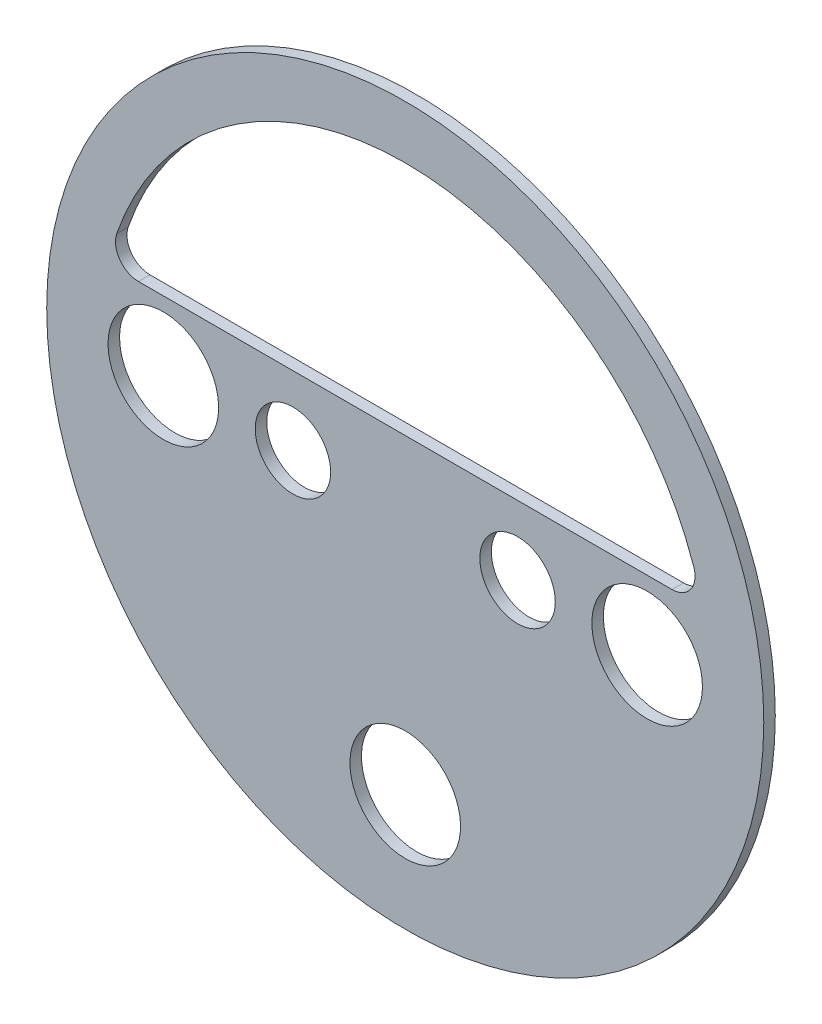
ISO-10303-21;
HEADER;
FILE_DESCRIPTION(('STEP AP214'),'2;1');
FILE_NAME('part.step','',(''),(''),'','','');
FILE_SCHEMA(('AUTOMOTIVE_DESIGN { 1 0 10303 214 1 1 1 1 }'));
ENDSEC;
DATA;
#1=APPLICATION_CONTEXT('core data for automotive mechanical design processes');
#2=APPLICATION_PROTOCOL_DEFINITION('international standard','automotive_design',2000,#1);
#3=PRODUCT_CONTEXT('',#1,'mechanical');
#4=PRODUCT('Part','Part','',(#3));
#5=PRODUCT_RELATED_PRODUCT_CATEGORY('part','',(#4));
#6=PRODUCT_DEFINITION_FORMATION('','',#4);
#7=PRODUCT_DEFINITION_CONTEXT('part definition',#1,'design');
#8=PRODUCT_DEFINITION('design','',#6,#7);
#9=PRODUCT_DEFINITION_SHAPE('','',#8);
#10=(LENGTH_UNIT() NAMED_UNIT(*) SI_UNIT(.MILLI.,.METRE.));
#11=(NAMED_UNIT(*) PLANE_ANGLE_UNIT() SI_UNIT($,.RADIAN.));
#12=(NAMED_UNIT(*) SI_UNIT($,.STERADIAN.) SOLID_ANGLE_UNIT());
#13=UNCERTAINTY_MEASURE_WITH_UNIT(LENGTH_MEASURE(1.E-05),#10,'distance_accuracy_value','');
#14=(GEOMETRIC_REPRESENTATION_CONTEXT(3) GLOBAL_UNCERTAINTY_ASSIGNED_CONTEXT((#13)) GLOBAL_UNIT_ASSIGNED_CONTEXT((#10,
#11,#12)) REPRESENTATION_CONTEXT('',''));
#15=CARTESIAN_POINT('',(0.,0.,0.));
#16=DIRECTION('',(0.,0.,1.));
#17=DIRECTION('',(1.,0.,0.));
#18=AXIS2_PLACEMENT_3D('',#15,#16,#17);
#19=CARTESIAN_POINT('',(-46.31414470764,16.,-1.000062000469));
#20=DIRECTION('',(0.,0.,1.));
#21=DIRECTION('',(0.,-1.,0.));
#22=AXIS2_PLACEMENT_3D('',#19,#20,#21);
#23=CYLINDRICAL_SURFACE('',#22,4.);
#24=CARTESIAN_POINT('',(-50.0949362899794,17.3059919643366,0.));
#25=DIRECTION('',(0.,0.,1.));
#26=VECTOR('',#25,1.);
#27=LINE('',#24,#26);
#28=CARTESIAN_POINT('',(-50.09491843085,17.30598579529,0.));
#29=VERTEX_POINT('',#28);
#30=CARTESIAN_POINT('',(-50.0949184298102,17.3059857949308,2.));
#31=VERTEX_POINT('',#30);
#32=EDGE_CURVE('E11',#29,#31,#27,.T.);
#33=ORIENTED_EDGE('',*,*,#32,.T.);
#34=CARTESIAN_POINT('',(-46.31414470764,16.,2.));
#35=DIRECTION('',(0.,0.,1.));
#36=DIRECTION('',(-0.945220430322506,0.326432746673702,0.));
#37=AXIS2_PLACEMENT_3D('',#34,#35,#36);
#38=CIRCLE('',#37,4.);
#39=CARTESIAN_POINT('',(-46.31414470764,12.,2.));
#40=VERTEX_POINT('',#39);
#41=EDGE_CURVE('E169',#31,#40,#38,.T.);
#42=ORIENTED_EDGE('',*,*,#41,.T.);
#43=DIRECTION('',(0.,0.,1.));
#44=VECTOR('',#43,1.);
#45=CARTESIAN_POINT('',(-46.31414470764,12.,0.));
#46=LINE('',#45,#44);
#47=CARTESIAN_POINT('',(-46.31414470764,12.,0.));
#48=VERTEX_POINT('',#47);
#49=EDGE_CURVE('E65',#48,#40,#46,.T.);
#50=ORIENTED_EDGE('',*,*,#49,.F.);
#51=CARTESIAN_POINT('',(-46.31414470764,16.,0.));
#52=DIRECTION('',(0.,0.,1.));
#53=DIRECTION('',(-0.945220430322506,0.326432746673702,0.));
#54=AXIS2_PLACEMENT_3D('',#51,#52,#53);
#55=CIRCLE('',#54,4.);
#56=EDGE_CURVE('E193',#29,#48,#55,.T.);
#57=ORIENTED_EDGE('',*,*,#56,.F.);
#58=EDGE_LOOP('',(#33,#42,#50,#57));
#59=FACE_BOUND('',#58,.T.);
#60=ADVANCED_FACE('F17',(#59),#23,.F.);
#61=CARTESIAN_POINT('',(0.,0.,2.));
#62=DIRECTION('',(0.,0.,-1.));
#63=DIRECTION('',(-1.,0.,0.));
#64=AXIS2_PLACEMENT_3D('',#61,#62,#63);
#65=CYLINDRICAL_SURFACE('',#64,53.);
#66=CARTESIAN_POINT('',(50.0949240913461,17.3060272819118,4.74897898783411E-11));
#67=CARTESIAN_POINT('',(50.0949254613367,17.306023316266,0.083333333370931));
#68=CARTESIAN_POINT('',(50.0949268313268,17.30601935062,0.166666666694372));
#69=CARTESIAN_POINT('',(50.094929571306,17.3060114193278,0.333333333341255));
#70=CARTESIAN_POINT('',(50.0949309412952,17.3060074536815,0.416666666664696));
#71=CARTESIAN_POINT('',(50.0949336812726,17.3059995223887,0.583333333311579));
#72=CARTESIAN_POINT('',(50.0949350512608,17.3059955567421,0.66666666663502));
#73=CARTESIAN_POINT('',(50.0949377912363,17.3059876254486,0.833333333281902));
#74=CARTESIAN_POINT('',(50.0949391612236,17.3059836598017,0.916666666605344));
#75=CARTESIAN_POINT('',(50.0949419011973,17.3059757285075,1.08333333325223));
#76=CARTESIAN_POINT('',(50.0949432711836,17.3059717628602,1.16666666657567));
#77=CARTESIAN_POINT('',(50.0949460111553,17.3059638315654,1.33333333322255));
#78=CARTESIAN_POINT('',(50.0949473811407,17.3059598659178,1.41666666654599));
#79=CARTESIAN_POINT('',(50.0949501211106,17.3059519346224,1.58333333319287));
#80=CARTESIAN_POINT('',(50.094951491095,17.3059479689745,1.66666666651631));
#81=CARTESIAN_POINT('',(50.094954231063,17.3059400376783,1.8333333331632));
#82=CARTESIAN_POINT('',(50.0949556010465,17.3059360720301,1.91666666648664));
#83=CARTESIAN_POINT('',(50.0949569710296,17.3059321063817,1.99999999981008));
#84=B_SPLINE_CURVE_WITH_KNOTS('',3,(#66,#67,#68,#69,#70,#71,#72,#73,#74,#75,#76,#77,#78,#79,#80,
#81,#82,#83),.UNSPECIFIED.,.F.,.F.,(4,2,2,2,2,2,2,2,4),(0.,0.250000000287182,0.500000000574363,
0.750000000861545,1.00000000114873,1.25000000143591,1.50000000172309,1.75000000201027,
2.00000000229745),.UNSPECIFIED.);
#85=CARTESIAN_POINT('',(50.0949045505953,17.306020531329,0.));
#86=VERTEX_POINT('',#85);
#87=CARTESIAN_POINT('',(50.094930916382,17.3059231054765,1.99999999981008));
#88=VERTEX_POINT('',#87);
#89=EDGE_CURVE('E31',#86,#88,#84,.T.);
#90=ORIENTED_EDGE('',*,*,#89,.T.);
#91=CARTESIAN_POINT('',(0.,0.,2.));
#92=DIRECTION('',(0.,0.,1.));
#93=DIRECTION('',(0.945190348723728,0.32651983811021,0.));
#94=AXIS2_PLACEMENT_3D('',#91,#92,#93);
#95=CIRCLE('',#94,53.);
#96=EDGE_CURVE('E183',#88,#31,#95,.T.);
#97=ORIENTED_EDGE('',*,*,#96,.T.);
#98=ORIENTED_EDGE('',*,*,#32,.F.);
#99=CARTESIAN_POINT('',(0.,0.,0.));
#100=DIRECTION('',(0.,0.,1.));
#101=DIRECTION('',(0.945188487637394,0.326525225423298,0.));
#102=AXIS2_PLACEMENT_3D('',#99,#100,#101);
#103=CIRCLE('',#102,53.);
#104=EDGE_CURVE('E197',#86,#29,#103,.T.);
#105=ORIENTED_EDGE('',*,*,#104,.F.);
#106=EDGE_LOOP('',(#90,#97,#98,#105));
#107=FACE_BOUND('',#106,.T.);
#108=ADVANCED_FACE('F19',(#107),#65,.F.);
#109=CARTESIAN_POINT('',(46.31414470764,16.,-1.0000358));
#110=DIRECTION('',(0.,0.,1.));
#111=DIRECTION('',(0.945186626686484,0.326530612244894,0.));
#112=AXIS2_PLACEMENT_3D('',#109,#110,#111);
#113=CYLINDRICAL_SURFACE('',#112,4.);
#114=DIRECTION('',(0.,0.,1.));
#115=VECTOR('',#114,1.);
#116=CARTESIAN_POINT('',(46.31414470764,12.,0.));
#117=LINE('',#116,#115);
#118=CARTESIAN_POINT('',(46.31414470764,12.,0.));
#119=VERTEX_POINT('',#118);
#120=CARTESIAN_POINT('',(46.31414470764,12.,2.));
#121=VERTEX_POINT('',#120);
#122=EDGE_CURVE('E182',#119,#121,#117,.T.);
#123=ORIENTED_EDGE('',*,*,#122,.T.);
#124=CARTESIAN_POINT('',(46.31414470764,16.,2.));
#125=DIRECTION('',(0.,0.,1.));
#126=DIRECTION('',(0.,-1.,0.));
#127=AXIS2_PLACEMENT_3D('',#124,#125,#126);
#128=CIRCLE('',#127,4.);
#129=EDGE_CURVE('E186',#121,#88,#128,.T.);
#130=ORIENTED_EDGE('',*,*,#129,.T.);
#131=ORIENTED_EDGE('',*,*,#89,.F.);
#132=CARTESIAN_POINT('',(46.31414470764,16.,0.));
#133=DIRECTION('',(0.,0.,1.));
#134=DIRECTION('',(0.,-1.,0.));
#135=AXIS2_PLACEMENT_3D('',#132,#133,#134);
#136=CIRCLE('',#135,4.);
#137=EDGE_CURVE('E263',#119,#86,#136,.T.);
#138=ORIENTED_EDGE('',*,*,#137,.F.);
#139=EDGE_LOOP('',(#123,#130,#131,#138));
#140=FACE_BOUND('',#139,.T.);
#141=ADVANCED_FACE('F248',(#140),#113,.F.);
#142=CARTESIAN_POINT('',(-61.08242382224,12.,2.));
#143=DIRECTION('',(0.,-1.,0.));
#144=DIRECTION('',(0.,0.,-1.));
#145=AXIS2_PLACEMENT_3D('',#142,#143,#144);
#146=PLANE('',#145);
#147=ORIENTED_EDGE('',*,*,#122,.F.);
#148=DIRECTION('',(1.,0.,0.));
#149=VECTOR('',#148,1.);
#150=CARTESIAN_POINT('',(-46.31414470764,12.,0.));
#151=LINE('',#150,#149);
#152=EDGE_CURVE('E163',#48,#119,#151,.T.);
#153=ORIENTED_EDGE('',*,*,#152,.F.);
#154=ORIENTED_EDGE('',*,*,#49,.T.);
#155=DIRECTION('',(1.,0.,0.));
#156=VECTOR('',#155,1.);
#157=CARTESIAN_POINT('',(-46.31414470764,12.,2.));
#158=LINE('',#157,#156);
#159=EDGE_CURVE('E167',#40,#121,#158,.T.);
#160=ORIENTED_EDGE('',*,*,#159,.T.);
#161=EDGE_LOOP('',(#147,#153,#154,#160));
#162=FACE_BOUND('',#161,.T.);
#163=ADVANCED_FACE('F223',(#162),#146,.F.);
#164=CARTESIAN_POINT('',(0.,-42.,2.));
#165=DIRECTION('',(0.,0.,-1.));
#166=DIRECTION('',(0.,1.,0.));
#167=AXIS2_PLACEMENT_3D('',#164,#165,#166);
#168=CYLINDRICAL_SURFACE('',#167,9.6);
#169=CARTESIAN_POINT('',(0.,-42.,2.));
#170=DIRECTION('',(0.,0.,-1.));
#171=DIRECTION('',(0.,1.,0.));
#172=AXIS2_PLACEMENT_3D('',#169,#170,#171);
#173=CIRCLE('',#172,9.6);
#174=CARTESIAN_POINT('',(0.,-51.6,2.));
#175=VERTEX_POINT('',#174);
#176=EDGE_CURVE('E157',#175,#175,#173,.T.);
#177=ORIENTED_EDGE('',*,*,#176,.F.);
#178=DIRECTION('',(0.,0.,-1.));
#179=VECTOR('',#178,1.);
#180=CARTESIAN_POINT('',(0.,-51.6,2.));
#181=LINE('',#180,#179);
#182=CARTESIAN_POINT('',(0.,-51.6,0.));
#183=VERTEX_POINT('',#182);
#184=EDGE_CURVE('E80',#175,#183,#181,.T.);
#185=ORIENTED_EDGE('',*,*,#184,.T.);
#186=CARTESIAN_POINT('',(0.,-42.,0.));
#187=DIRECTION('',(0.,0.,-1.));
#188=DIRECTION('',(0.,1.,0.));
#189=AXIS2_PLACEMENT_3D('',#186,#187,#188);
#190=CIRCLE('',#189,9.6);
#191=EDGE_CURVE('E267',#183,#183,#190,.T.);
#192=ORIENTED_EDGE('',*,*,#191,.T.);
#193=ORIENTED_EDGE('',*,*,#184,.F.);
#194=EDGE_LOOP('',(#177,#185,#192,#193));
#195=FACE_BOUND('',#194,.T.);
#196=ADVANCED_FACE('F228',(#195),#168,.F.);
#197=CARTESIAN_POINT('',(-42.,0.,2.));
#198=DIRECTION('',(0.,0.,-1.));
#199=DIRECTION('',(1.,0.,0.));
#200=AXIS2_PLACEMENT_3D('',#197,#198,#199);
#201=CYLINDRICAL_SURFACE('',#200,9.6);
#202=CARTESIAN_POINT('',(-42.,0.,2.));
#203=DIRECTION('',(0.,0.,-1.));
#204=DIRECTION('',(1.,0.,0.));
#205=AXIS2_PLACEMENT_3D('',#202,#203,#204);
#206=CIRCLE('',#205,9.6);
#207=CARTESIAN_POINT('',(-51.6,0.,2.));
#208=VERTEX_POINT('',#207);
#209=EDGE_CURVE('E148',#208,#208,#206,.T.);
#210=ORIENTED_EDGE('',*,*,#209,.F.);
#211=DIRECTION('',(0.,0.,-1.));
#212=VECTOR('',#211,1.);
#213=CARTESIAN_POINT('',(-51.6,0.,2.));
#214=LINE('',#213,#212);
#215=CARTESIAN_POINT('',(-51.6,0.,0.));
#216=VERTEX_POINT('',#215);
#217=EDGE_CURVE('E142',#208,#216,#214,.T.);
#218=ORIENTED_EDGE('',*,*,#217,.T.);
#219=CARTESIAN_POINT('',(-42.,0.,0.));
#220=DIRECTION('',(0.,0.,-1.));
#221=DIRECTION('',(1.,0.,0.));
#222=AXIS2_PLACEMENT_3D('',#219,#220,#221);
#223=CIRCLE('',#222,9.6);
#224=EDGE_CURVE('E257',#216,#216,#223,.T.);
#225=ORIENTED_EDGE('',*,*,#224,.T.);
#226=ORIENTED_EDGE('',*,*,#217,.F.);
#227=EDGE_LOOP('',(#210,#218,#225,#226));
#228=FACE_BOUND('',#227,.T.);
#229=ADVANCED_FACE('F225',(#228),#201,.F.);
#230=CARTESIAN_POINT('',(-19.5,0.,2.));
#231=DIRECTION('',(0.,0.,-1.));
#232=DIRECTION('',(-1.,0.,0.));
#233=AXIS2_PLACEMENT_3D('',#230,#231,#232);
#234=CYLINDRICAL_SURFACE('',#233,6.55);
#235=CARTESIAN_POINT('',(-19.5,0.,2.));
#236=DIRECTION('',(0.,0.,-1.));
#237=DIRECTION('',(-1.,0.,0.));
#238=AXIS2_PLACEMENT_3D('',#235,#236,#237);
#239=CIRCLE('',#238,6.55);
#240=CARTESIAN_POINT('',(-12.95,0.,2.));
#241=VERTEX_POINT('',#240);
#242=EDGE_CURVE('E138',#241,#241,#239,.T.);
#243=ORIENTED_EDGE('',*,*,#242,.F.);
#244=DIRECTION('',(0.,0.,-1.));
#245=VECTOR('',#244,1.);
#246=CARTESIAN_POINT('',(-12.95,0.,2.));
#247=LINE('',#246,#245);
#248=CARTESIAN_POINT('',(-12.95,0.,0.));
#249=VERTEX_POINT('',#248);
#250=EDGE_CURVE('E135',#241,#249,#247,.T.);
#251=ORIENTED_EDGE('',*,*,#250,.T.);
#252=CARTESIAN_POINT('',(-19.5,0.,0.));
#253=DIRECTION('',(0.,0.,-1.));
#254=DIRECTION('',(-1.,0.,0.));
#255=AXIS2_PLACEMENT_3D('',#252,#253,#254);
#256=CIRCLE('',#255,6.55);
#257=EDGE_CURVE('E140',#249,#249,#256,.T.);
#258=ORIENTED_EDGE('',*,*,#257,.T.);
#259=ORIENTED_EDGE('',*,*,#250,.F.);
#260=EDGE_LOOP('',(#243,#251,#258,#259));
#261=FACE_BOUND('',#260,.T.);
#262=ADVANCED_FACE('F137',(#261),#234,.F.);
#263=CARTESIAN_POINT('',(42.,0.,2.));
#264=DIRECTION('',(0.,0.,-1.));
#265=DIRECTION('',(-1.,0.,0.));
#266=AXIS2_PLACEMENT_3D('',#263,#264,#265);
#267=CYLINDRICAL_SURFACE('',#266,9.6);
#268=CARTESIAN_POINT('',(42.,0.,2.));
#269=DIRECTION('',(0.,0.,-1.));
#270=DIRECTION('',(-1.,0.,0.));
#271=AXIS2_PLACEMENT_3D('',#268,#269,#270);
#272=CIRCLE('',#271,9.6);
#273=CARTESIAN_POINT('',(51.6,0.,2.));
#274=VERTEX_POINT('',#273);
#275=EDGE_CURVE('E149',#274,#274,#272,.T.);
#276=ORIENTED_EDGE('',*,*,#275,.F.);
#277=DIRECTION('',(0.,0.,-1.));
#278=VECTOR('',#277,1.);
#279=CARTESIAN_POINT('',(51.6,0.,2.));
#280=LINE('',#279,#278);
#281=CARTESIAN_POINT('',(51.6,0.,0.));
#282=VERTEX_POINT('',#281);
#283=EDGE_CURVE('E126',#274,#282,#280,.T.);
#284=ORIENTED_EDGE('',*,*,#283,.T.);
#285=CARTESIAN_POINT('',(42.,0.,0.));
#286=DIRECTION('',(0.,0.,-1.));
#287=DIRECTION('',(-1.,0.,0.));
#288=AXIS2_PLACEMENT_3D('',#285,#286,#287);
#289=CIRCLE('',#288,9.6);
#290=EDGE_CURVE('E179',#282,#282,#289,.T.);
#291=ORIENTED_EDGE('',*,*,#290,.T.);
#292=ORIENTED_EDGE('',*,*,#283,.F.);
#293=EDGE_LOOP('',(#276,#284,#291,#292));
#294=FACE_BOUND('',#293,.T.);
#295=ADVANCED_FACE('F235',(#294),#267,.F.);
#296=CARTESIAN_POINT('',(0.,0.,0.));
#297=DIRECTION('',(0.,0.,1.));
#298=DIRECTION('',(1.,0.,0.));
#299=AXIS2_PLACEMENT_3D('',#296,#297,#298);
#300=CYLINDRICAL_SURFACE('',#299,62.25);
#301=CARTESIAN_POINT('',(0.,0.,2.));
#302=DIRECTION('',(0.,0.,1.));
#303=DIRECTION('',(-0.981243756180604,0.192771084337301,0.));
#304=AXIS2_PLACEMENT_3D('',#301,#302,#303);
#305=CIRCLE('',#304,62.25);
#306=CARTESIAN_POINT('',(-62.25,0.,2.));
#307=VERTEX_POINT('',#306);
#308=EDGE_CURVE('E159',#307,#307,#305,.T.);
#309=ORIENTED_EDGE('',*,*,#308,.F.);
#310=DIRECTION('',(0.,0.,-1.));
#311=VECTOR('',#310,1.);
#312=CARTESIAN_POINT('',(-62.25,0.,0.));
#313=LINE('',#312,#311);
#314=CARTESIAN_POINT('',(-62.25,0.,0.));
#315=VERTEX_POINT('',#314);
#316=EDGE_CURVE('E274',#307,#315,#313,.T.);
#317=ORIENTED_EDGE('',*,*,#316,.T.);
#318=CARTESIAN_POINT('',(0.,0.,0.));
#319=DIRECTION('',(0.,0.,-1.));
#320=DIRECTION('',(0.981243756180604,0.192771084337301,0.));
#321=AXIS2_PLACEMENT_3D('',#318,#319,#320);
#322=CIRCLE('',#321,62.25);
#323=EDGE_CURVE('E175',#315,#315,#322,.T.);
#324=ORIENTED_EDGE('',*,*,#323,.F.);
#325=ORIENTED_EDGE('',*,*,#316,.F.);
#326=EDGE_LOOP('',(#309,#317,#324,#325));
#327=FACE_BOUND('',#326,.T.);
#328=ADVANCED_FACE('F238',(#327),#300,.T.);
#329=CARTESIAN_POINT('',(0.,0.,2.));
#330=DIRECTION('',(0.,0.,1.));
#331=DIRECTION('',(1.,0.,0.));
#332=AXIS2_PLACEMENT_3D('',#329,#330,#331);
#333=PLANE('',#332);
#334=ORIENTED_EDGE('',*,*,#159,.F.);
#335=ORIENTED_EDGE('',*,*,#41,.F.);
#336=ORIENTED_EDGE('',*,*,#96,.F.);
#337=ORIENTED_EDGE('',*,*,#129,.F.);
#338=EDGE_LOOP('',(#334,#335,#336,#337));
#339=FACE_BOUND('',#338,.T.);
#340=ORIENTED_EDGE('',*,*,#176,.T.);
#341=EDGE_LOOP('',(#340));
#342=FACE_BOUND('',#341,.T.);
#343=ORIENTED_EDGE('',*,*,#209,.T.);
#344=EDGE_LOOP('',(#343));
#345=FACE_BOUND('',#344,.T.);
#346=ORIENTED_EDGE('',*,*,#242,.T.);
#347=EDGE_LOOP('',(#346));
#348=FACE_BOUND('',#347,.T.);
#349=ORIENTED_EDGE('',*,*,#275,.T.);
#350=EDGE_LOOP('',(#349));
#351=FACE_BOUND('',#350,.T.);
#352=CARTESIAN_POINT('',(19.5,0.,2.));
#353=DIRECTION('',(0.,0.,-1.));
#354=DIRECTION('',(-1.,0.,0.));
#355=AXIS2_PLACEMENT_3D('',#352,#353,#354);
#356=CIRCLE('',#355,6.55);
#357=CARTESIAN_POINT('',(26.05,0.,2.));
#358=VERTEX_POINT('',#357);
#359=EDGE_CURVE('E259',#358,#358,#356,.T.);
#360=ORIENTED_EDGE('',*,*,#359,.T.);
#361=EDGE_LOOP('',(#360));
#362=FACE_BOUND('',#361,.T.);
#363=ORIENTED_EDGE('',*,*,#308,.T.);
#364=EDGE_LOOP('',(#363));
#365=FACE_BOUND('',#364,.T.);
#366=ADVANCED_FACE('F145',(#339,#342,#345,#348,#351,#362,#365),#333,.T.);
#367=CARTESIAN_POINT('',(19.5,0.,2.));
#368=DIRECTION('',(0.,0.,-1.));
#369=DIRECTION('',(-1.,0.,0.));
#370=AXIS2_PLACEMENT_3D('',#367,#368,#369);
#371=CYLINDRICAL_SURFACE('',#370,6.55);
#372=ORIENTED_EDGE('',*,*,#359,.F.);
#373=DIRECTION('',(0.,0.,-1.));
#374=VECTOR('',#373,1.);
#375=CARTESIAN_POINT('',(26.05,0.,2.));
#376=LINE('',#375,#374);
#377=CARTESIAN_POINT('',(26.05,0.,0.));
#378=VERTEX_POINT('',#377);
#379=EDGE_CURVE('E174',#358,#378,#376,.T.);
#380=ORIENTED_EDGE('',*,*,#379,.T.);
#381=CARTESIAN_POINT('',(19.5,0.,0.));
#382=DIRECTION('',(0.,0.,-1.));
#383=DIRECTION('',(-1.,0.,0.));
#384=AXIS2_PLACEMENT_3D('',#381,#382,#383);
#385=CIRCLE('',#384,6.55);
#386=EDGE_CURVE('E203',#378,#378,#385,.T.);
#387=ORIENTED_EDGE('',*,*,#386,.T.);
#388=ORIENTED_EDGE('',*,*,#379,.F.);
#389=EDGE_LOOP('',(#372,#380,#387,#388));
#390=FACE_BOUND('',#389,.T.);
#391=ADVANCED_FACE('F233',(#390),#371,.F.);
#392=CARTESIAN_POINT('',(0.,0.,0.));
#393=DIRECTION('',(0.,0.,1.));
#394=DIRECTION('',(1.,0.,0.));
#395=AXIS2_PLACEMENT_3D('',#392,#393,#394);
#396=PLANE('',#395);
#397=ORIENTED_EDGE('',*,*,#104,.T.);
#398=ORIENTED_EDGE('',*,*,#56,.T.);
#399=ORIENTED_EDGE('',*,*,#152,.T.);
#400=ORIENTED_EDGE('',*,*,#137,.T.);
#401=EDGE_LOOP('',(#397,#398,#399,#400));
#402=FACE_BOUND('',#401,.T.);
#403=ORIENTED_EDGE('',*,*,#386,.F.);
#404=EDGE_LOOP('',(#403));
#405=FACE_BOUND('',#404,.T.);
#406=ORIENTED_EDGE('',*,*,#191,.F.);
#407=EDGE_LOOP('',(#406));
#408=FACE_BOUND('',#407,.T.);
#409=ORIENTED_EDGE('',*,*,#224,.F.);
#410=EDGE_LOOP('',(#409));
#411=FACE_BOUND('',#410,.T.);
#412=ORIENTED_EDGE('',*,*,#257,.F.);
#413=EDGE_LOOP('',(#412));
#414=FACE_BOUND('',#413,.T.);
#415=ORIENTED_EDGE('',*,*,#290,.F.);
#416=EDGE_LOOP('',(#415));
#417=FACE_BOUND('',#416,.T.);
#418=ORIENTED_EDGE('',*,*,#323,.T.);
#419=EDGE_LOOP('',(#418));
#420=FACE_BOUND('',#419,.T.);
#421=ADVANCED_FACE('F230',(#402,#405,#408,#411,#414,#417,#420),#396,.F.);
#422=CLOSED_SHELL('',(#60,#108,#141,#163,#196,#229,#262,#295,#328,#366,#391,#421));
#423=MANIFOLD_SOLID_BREP('B1',#422);
#424=ADVANCED_BREP_SHAPE_REPRESENTATION('',(#18,#423),#14);
#425=SHAPE_DEFINITION_REPRESENTATION(#9,#424);
ENDSEC;
END-ISO-10303-21;
